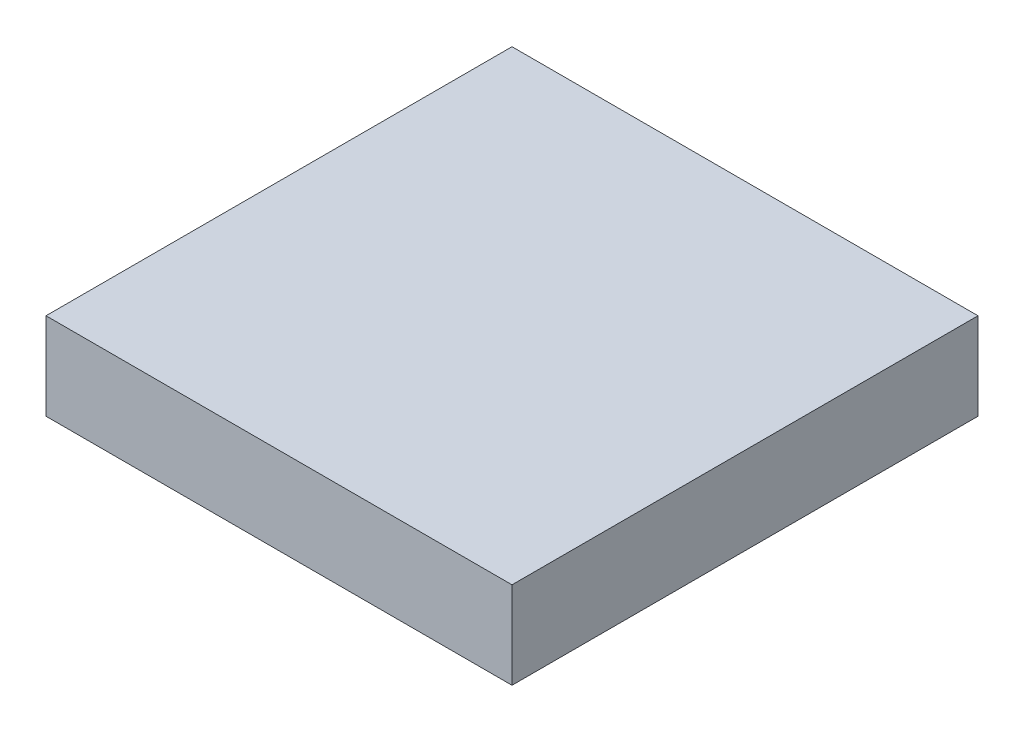
ISO-10303-21;
HEADER;
FILE_DESCRIPTION(('STEP AP214'),'2;1');
FILE_NAME('part.step','',(''),(''),'','','');
FILE_SCHEMA(('AUTOMOTIVE_DESIGN { 1 0 10303 214 1 1 1 1 }'));
ENDSEC;
DATA;
#1=APPLICATION_CONTEXT('core data for automotive mechanical design processes');
#2=APPLICATION_PROTOCOL_DEFINITION('international standard','automotive_design',2000,#1);
#3=PRODUCT_CONTEXT('',#1,'mechanical');
#4=PRODUCT('Part','Part','',(#3));
#5=PRODUCT_RELATED_PRODUCT_CATEGORY('part','',(#4));
#6=PRODUCT_DEFINITION_FORMATION('','',#4);
#7=PRODUCT_DEFINITION_CONTEXT('part definition',#1,'design');
#8=PRODUCT_DEFINITION('design','',#6,#7);
#9=PRODUCT_DEFINITION_SHAPE('','',#8);
#10=(LENGTH_UNIT() NAMED_UNIT(*) SI_UNIT(.MILLI.,.METRE.));
#11=(NAMED_UNIT(*) PLANE_ANGLE_UNIT() SI_UNIT($,.RADIAN.));
#12=(NAMED_UNIT(*) SI_UNIT($,.STERADIAN.) SOLID_ANGLE_UNIT());
#13=UNCERTAINTY_MEASURE_WITH_UNIT(LENGTH_MEASURE(1.E-05),#10,'distance_accuracy_value','');
#14=(GEOMETRIC_REPRESENTATION_CONTEXT(3) GLOBAL_UNCERTAINTY_ASSIGNED_CONTEXT((#13)) GLOBAL_UNIT_ASSIGNED_CONTEXT((#10,
#11,#12)) REPRESENTATION_CONTEXT('',''));
#15=CARTESIAN_POINT('',(0.,0.,0.));
#16=DIRECTION('',(0.,0.,1.));
#17=DIRECTION('',(1.,0.,0.));
#18=AXIS2_PLACEMENT_3D('',#15,#16,#17);
#19=CARTESIAN_POINT('',(8.5,3.175,-8.5));
#20=DIRECTION('',(-1.,0.,0.));
#21=DIRECTION('',(0.,0.,1.));
#22=AXIS2_PLACEMENT_3D('',#19,#20,#21);
#23=PLANE('',#22);
#24=DIRECTION('',(0.,0.,-1.));
#25=VECTOR('',#24,1.);
#26=CARTESIAN_POINT('',(8.5,0.,-8.5));
#27=LINE('',#26,#25);
#28=CARTESIAN_POINT('',(8.5,0.,8.5));
#29=VERTEX_POINT('',#28);
#30=CARTESIAN_POINT('',(8.5,0.,-8.5));
#31=VERTEX_POINT('',#30);
#32=EDGE_CURVE('E107',#29,#31,#27,.T.);
#33=ORIENTED_EDGE('',*,*,#32,.T.);
#34=DIRECTION('',(0.,-1.,0.));
#35=VECTOR('',#34,1.);
#36=CARTESIAN_POINT('',(8.5,3.175,-8.5));
#37=LINE('',#36,#35);
#38=CARTESIAN_POINT('',(8.5,3.175,-8.5));
#39=VERTEX_POINT('',#38);
#40=EDGE_CURVE('E11',#39,#31,#37,.T.);
#41=ORIENTED_EDGE('',*,*,#40,.F.);
#42=DIRECTION('',(0.,0.,-1.));
#43=VECTOR('',#42,1.);
#44=CARTESIAN_POINT('',(8.5,3.175,-8.5));
#45=LINE('',#44,#43);
#46=CARTESIAN_POINT('',(8.5,3.175,8.5));
#47=VERTEX_POINT('',#46);
#48=EDGE_CURVE('E91',#47,#39,#45,.T.);
#49=ORIENTED_EDGE('',*,*,#48,.F.);
#50=DIRECTION('',(0.,-1.,0.));
#51=VECTOR('',#50,1.);
#52=CARTESIAN_POINT('',(8.5,3.175,8.5));
#53=LINE('',#52,#51);
#54=EDGE_CURVE('E103',#47,#29,#53,.T.);
#55=ORIENTED_EDGE('',*,*,#54,.T.);
#56=EDGE_LOOP('',(#33,#41,#49,#55));
#57=FACE_BOUND('',#56,.T.);
#58=ADVANCED_FACE('F39',(#57),#23,.F.);
#59=CARTESIAN_POINT('',(-8.5,3.175,-8.5));
#60=DIRECTION('',(0.,0.,1.));
#61=DIRECTION('',(1.,0.,0.));
#62=AXIS2_PLACEMENT_3D('',#59,#60,#61);
#63=PLANE('',#62);
#64=DIRECTION('',(-1.,0.,0.));
#65=VECTOR('',#64,1.);
#66=CARTESIAN_POINT('',(-8.5,0.,-8.5));
#67=LINE('',#66,#65);
#68=CARTESIAN_POINT('',(-8.5,0.,-8.5));
#69=VERTEX_POINT('',#68);
#70=EDGE_CURVE('E96',#31,#69,#67,.T.);
#71=ORIENTED_EDGE('',*,*,#70,.T.);
#72=DIRECTION('',(0.,-1.,0.));
#73=VECTOR('',#72,1.);
#74=CARTESIAN_POINT('',(-8.5,3.175,-8.5));
#75=LINE('',#74,#73);
#76=CARTESIAN_POINT('',(-8.5,3.175,-8.5));
#77=VERTEX_POINT('',#76);
#78=EDGE_CURVE('E48',#77,#69,#75,.T.);
#79=ORIENTED_EDGE('',*,*,#78,.F.);
#80=DIRECTION('',(-1.,0.,0.));
#81=VECTOR('',#80,1.);
#82=CARTESIAN_POINT('',(-8.5,3.175,-8.5));
#83=LINE('',#82,#81);
#84=EDGE_CURVE('E86',#39,#77,#83,.T.);
#85=ORIENTED_EDGE('',*,*,#84,.F.);
#86=ORIENTED_EDGE('',*,*,#40,.T.);
#87=EDGE_LOOP('',(#71,#79,#85,#86));
#88=FACE_BOUND('',#87,.T.);
#89=ADVANCED_FACE('F95',(#88),#63,.F.);
#90=CARTESIAN_POINT('',(-8.5,3.175,-8.5));
#91=DIRECTION('',(1.,0.,0.));
#92=DIRECTION('',(0.,0.,-1.));
#93=AXIS2_PLACEMENT_3D('',#90,#91,#92);
#94=PLANE('',#93);
#95=DIRECTION('',(0.,0.,1.));
#96=VECTOR('',#95,1.);
#97=CARTESIAN_POINT('',(-8.5,0.,-8.5));
#98=LINE('',#97,#96);
#99=CARTESIAN_POINT('',(-8.5,0.,8.5));
#100=VERTEX_POINT('',#99);
#101=EDGE_CURVE('E73',#69,#100,#98,.T.);
#102=ORIENTED_EDGE('',*,*,#101,.T.);
#103=DIRECTION('',(0.,-1.,0.));
#104=VECTOR('',#103,1.);
#105=CARTESIAN_POINT('',(-8.5,3.175,8.5));
#106=LINE('',#105,#104);
#107=CARTESIAN_POINT('',(-8.5,3.175,8.5));
#108=VERTEX_POINT('',#107);
#109=EDGE_CURVE('E98',#108,#100,#106,.T.);
#110=ORIENTED_EDGE('',*,*,#109,.F.);
#111=DIRECTION('',(0.,0.,1.));
#112=VECTOR('',#111,1.);
#113=CARTESIAN_POINT('',(-8.5,3.175,-8.5));
#114=LINE('',#113,#112);
#115=EDGE_CURVE('E89',#77,#108,#114,.T.);
#116=ORIENTED_EDGE('',*,*,#115,.F.);
#117=ORIENTED_EDGE('',*,*,#78,.T.);
#118=EDGE_LOOP('',(#102,#110,#116,#117));
#119=FACE_BOUND('',#118,.T.);
#120=ADVANCED_FACE('F99',(#119),#94,.F.);
#121=CARTESIAN_POINT('',(-8.5,3.175,8.5));
#122=DIRECTION('',(0.,0.,-1.));
#123=DIRECTION('',(-1.,0.,0.));
#124=AXIS2_PLACEMENT_3D('',#121,#122,#123);
#125=PLANE('',#124);
#126=DIRECTION('',(1.,0.,0.));
#127=VECTOR('',#126,1.);
#128=CARTESIAN_POINT('',(-8.5,0.,8.5));
#129=LINE('',#128,#127);
#130=EDGE_CURVE('E79',#100,#29,#129,.T.);
#131=ORIENTED_EDGE('',*,*,#130,.T.);
#132=ORIENTED_EDGE('',*,*,#54,.F.);
#133=DIRECTION('',(1.,0.,0.));
#134=VECTOR('',#133,1.);
#135=CARTESIAN_POINT('',(-8.5,3.175,8.5));
#136=LINE('',#135,#134);
#137=EDGE_CURVE('E56',#108,#47,#136,.T.);
#138=ORIENTED_EDGE('',*,*,#137,.F.);
#139=ORIENTED_EDGE('',*,*,#109,.T.);
#140=EDGE_LOOP('',(#131,#132,#138,#139));
#141=FACE_BOUND('',#140,.T.);
#142=ADVANCED_FACE('F120',(#141),#125,.F.);
#143=CARTESIAN_POINT('',(0.,3.175,0.));
#144=DIRECTION('',(0.,1.,0.));
#145=DIRECTION('',(0.,0.,1.));
#146=AXIS2_PLACEMENT_3D('',#143,#144,#145);
#147=PLANE('',#146);
#148=ORIENTED_EDGE('',*,*,#48,.T.);
#149=ORIENTED_EDGE('',*,*,#84,.T.);
#150=ORIENTED_EDGE('',*,*,#115,.T.);
#151=ORIENTED_EDGE('',*,*,#137,.T.);
#152=EDGE_LOOP('',(#148,#149,#150,#151));
#153=FACE_BOUND('',#152,.T.);
#154=ADVANCED_FACE('F87',(#153),#147,.T.);
#155=CARTESIAN_POINT('',(0.,0.,0.));
#156=DIRECTION('',(0.,1.,0.));
#157=DIRECTION('',(0.,0.,1.));
#158=AXIS2_PLACEMENT_3D('',#155,#156,#157);
#159=PLANE('',#158);
#160=ORIENTED_EDGE('',*,*,#32,.F.);
#161=ORIENTED_EDGE('',*,*,#130,.F.);
#162=ORIENTED_EDGE('',*,*,#101,.F.);
#163=ORIENTED_EDGE('',*,*,#70,.F.);
#164=EDGE_LOOP('',(#160,#161,#162,#163));
#165=FACE_BOUND('',#164,.T.);
#166=ADVANCED_FACE('F123',(#165),#159,.F.);
#167=CLOSED_SHELL('',(#58,#89,#120,#142,#154,#166));
#168=MANIFOLD_SOLID_BREP('B2',#167);
#169=ADVANCED_BREP_SHAPE_REPRESENTATION('',(#18,#168),#14);
#170=SHAPE_DEFINITION_REPRESENTATION(#9,#169);
ENDSEC;
END-ISO-10303-21;
